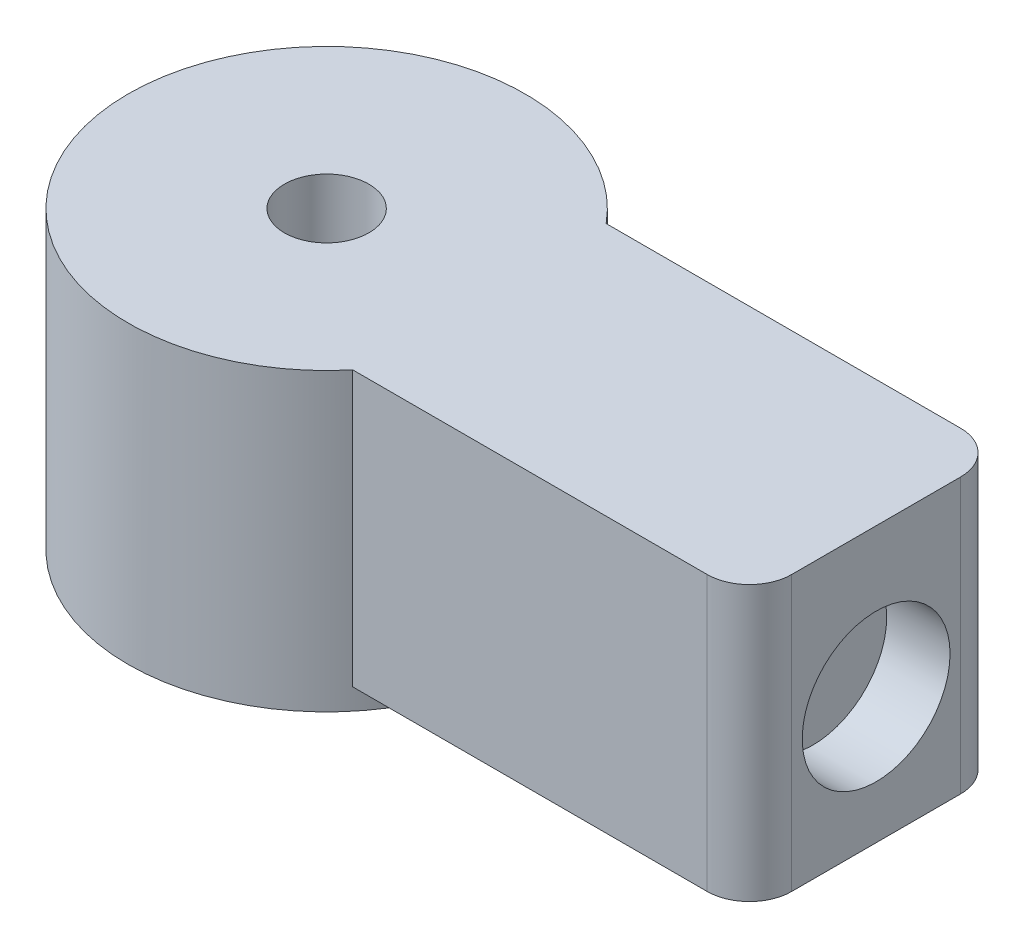
ISO-10303-21;
HEADER;
FILE_DESCRIPTION(('STEP AP214'),'2;1');
FILE_NAME('part.step','',(''),(''),'','','');
FILE_SCHEMA(('AUTOMOTIVE_DESIGN { 1 0 10303 214 1 1 1 1 }'));
ENDSEC;
DATA;
#1=APPLICATION_CONTEXT('core data for automotive mechanical design processes');
#2=APPLICATION_PROTOCOL_DEFINITION('international standard','automotive_design',2000,#1);
#3=PRODUCT_CONTEXT('',#1,'mechanical');
#4=PRODUCT('Part','Part','',(#3));
#5=PRODUCT_RELATED_PRODUCT_CATEGORY('part','',(#4));
#6=PRODUCT_DEFINITION_FORMATION('','',#4);
#7=PRODUCT_DEFINITION_CONTEXT('part definition',#1,'design');
#8=PRODUCT_DEFINITION('design','',#6,#7);
#9=PRODUCT_DEFINITION_SHAPE('','',#8);
#10=(LENGTH_UNIT() NAMED_UNIT(*) SI_UNIT(.MILLI.,.METRE.));
#11=(NAMED_UNIT(*) PLANE_ANGLE_UNIT() SI_UNIT($,.RADIAN.));
#12=(NAMED_UNIT(*) SI_UNIT($,.STERADIAN.) SOLID_ANGLE_UNIT());
#13=UNCERTAINTY_MEASURE_WITH_UNIT(LENGTH_MEASURE(1.E-05),#10,'distance_accuracy_value','');
#14=(GEOMETRIC_REPRESENTATION_CONTEXT(3) GLOBAL_UNCERTAINTY_ASSIGNED_CONTEXT((#13)) GLOBAL_UNIT_ASSIGNED_CONTEXT((#10,
#11,#12)) REPRESENTATION_CONTEXT('',''));
#15=CARTESIAN_POINT('',(0.,0.,0.));
#16=DIRECTION('',(0.,0.,1.));
#17=DIRECTION('',(1.,0.,0.));
#18=AXIS2_PLACEMENT_3D('',#15,#16,#17);
#19=CARTESIAN_POINT('',(0.,2.5,0.));
#20=DIRECTION('',(0.,-1.,0.));
#21=DIRECTION('',(0.,0.,-1.));
#22=AXIS2_PLACEMENT_3D('',#19,#20,#21);
#23=CYLINDRICAL_SURFACE('',#22,4.7);
#24=CARTESIAN_POINT('',(0.,0.,0.));
#25=DIRECTION('',(0.,1.,0.));
#26=DIRECTION('',(0.,0.,1.));
#27=AXIS2_PLACEMENT_3D('',#24,#25,#26);
#28=CIRCLE('',#27,4.7);
#29=CARTESIAN_POINT('',(0.,0.,4.7));
#30=VERTEX_POINT('',#29);
#31=EDGE_CURVE('E145',#30,#30,#28,.T.);
#32=ORIENTED_EDGE('',*,*,#31,.T.);
#33=EDGE_LOOP('',(#32));
#34=FACE_BOUND('',#33,.T.);
#35=CARTESIAN_POINT('',(0.,7.,0.));
#36=DIRECTION('',(0.,1.,0.));
#37=DIRECTION('',(0.,0.,1.));
#38=AXIS2_PLACEMENT_3D('',#35,#36,#37);
#39=CIRCLE('',#38,4.7);
#40=CARTESIAN_POINT('',(3.61801050302511,7.,-3.));
#41=VERTEX_POINT('',#40);
#42=CARTESIAN_POINT('',(3.61801050302511,7.,3.));
#43=VERTEX_POINT('',#42);
#44=EDGE_CURVE('E135',#41,#43,#39,.T.);
#45=ORIENTED_EDGE('',*,*,#44,.F.);
#46=DIRECTION('',(0.,-1.,0.));
#47=VECTOR('',#46,1.);
#48=CARTESIAN_POINT('',(3.61801050302511,2.5,-3.));
#49=LINE('',#48,#47);
#50=CARTESIAN_POINT('',(3.61801050302511,0.5,-3.));
#51=VERTEX_POINT('',#50);
#52=EDGE_CURVE('E50',#51,#41,#49,.F.);
#53=ORIENTED_EDGE('',*,*,#52,.F.);
#54=CARTESIAN_POINT('',(0.,0.5,0.));
#55=DIRECTION('',(0.,1.,0.));
#56=DIRECTION('',(0.,0.,1.));
#57=AXIS2_PLACEMENT_3D('',#54,#55,#56);
#58=CIRCLE('',#57,4.7);
#59=CARTESIAN_POINT('',(3.61801050302511,0.499999999999999,3.));
#60=VERTEX_POINT('',#59);
#61=EDGE_CURVE('E148',#60,#51,#58,.T.);
#62=ORIENTED_EDGE('',*,*,#61,.F.);
#63=DIRECTION('',(0.,-1.,0.));
#64=VECTOR('',#63,1.);
#65=CARTESIAN_POINT('',(3.61801050302511,2.5,3.));
#66=LINE('',#65,#64);
#67=EDGE_CURVE('E57',#43,#60,#66,.T.);
#68=ORIENTED_EDGE('',*,*,#67,.F.);
#69=EDGE_LOOP('',(#45,#53,#62,#68));
#70=FACE_BOUND('',#69,.T.);
#71=ADVANCED_FACE('F35',(#34,#70),#23,.T.);
#72=CARTESIAN_POINT('',(0.,0.,0.));
#73=DIRECTION('',(0.,1.,0.));
#74=DIRECTION('',(0.,0.,1.));
#75=AXIS2_PLACEMENT_3D('',#72,#73,#74);
#76=PLANE('',#75);
#77=ORIENTED_EDGE('',*,*,#31,.F.);
#78=EDGE_LOOP('',(#77));
#79=FACE_BOUND('',#78,.T.);
#80=CARTESIAN_POINT('',(0.,0.,0.));
#81=DIRECTION('',(0.,1.,0.));
#82=DIRECTION('',(0.,0.,1.));
#83=AXIS2_PLACEMENT_3D('',#80,#81,#82);
#84=CIRCLE('',#83,2.5);
#85=CARTESIAN_POINT('',(0.,0.,2.5));
#86=VERTEX_POINT('',#85);
#87=EDGE_CURVE('E142',#86,#86,#84,.T.);
#88=ORIENTED_EDGE('',*,*,#87,.T.);
#89=EDGE_LOOP('',(#88));
#90=FACE_BOUND('',#89,.T.);
#91=ADVANCED_FACE('F176',(#79,#90),#76,.F.);
#92=CARTESIAN_POINT('',(0.,2.5,0.));
#93=DIRECTION('',(0.,-1.,0.));
#94=DIRECTION('',(0.,0.,-1.));
#95=AXIS2_PLACEMENT_3D('',#92,#93,#94);
#96=CYLINDRICAL_SURFACE('',#95,2.5);
#97=CARTESIAN_POINT('',(0.,2.5,0.));
#98=DIRECTION('',(0.,1.,0.));
#99=DIRECTION('',(0.,0.,1.));
#100=AXIS2_PLACEMENT_3D('',#97,#98,#99);
#101=CIRCLE('',#100,2.5);
#102=CARTESIAN_POINT('',(0.,2.5,2.5));
#103=VERTEX_POINT('',#102);
#104=EDGE_CURVE('E139',#103,#103,#101,.T.);
#105=ORIENTED_EDGE('',*,*,#104,.T.);
#106=EDGE_LOOP('',(#105));
#107=FACE_BOUND('',#106,.T.);
#108=ORIENTED_EDGE('',*,*,#87,.F.);
#109=EDGE_LOOP('',(#108));
#110=FACE_BOUND('',#109,.T.);
#111=ADVANCED_FACE('F182',(#107,#110),#96,.F.);
#112=CARTESIAN_POINT('',(0.,2.5,0.));
#113=DIRECTION('',(0.,1.,0.));
#114=DIRECTION('',(0.,0.,1.));
#115=AXIS2_PLACEMENT_3D('',#112,#113,#114);
#116=PLANE('',#115);
#117=CARTESIAN_POINT('',(0.,2.5,0.));
#118=DIRECTION('',(0.,1.,0.));
#119=DIRECTION('',(0.,0.,1.));
#120=AXIS2_PLACEMENT_3D('',#117,#118,#119);
#121=CIRCLE('',#120,1.);
#122=CARTESIAN_POINT('',(0.,2.5,1.));
#123=VERTEX_POINT('',#122);
#124=EDGE_CURVE('E132',#123,#123,#121,.T.);
#125=ORIENTED_EDGE('',*,*,#124,.T.);
#126=EDGE_LOOP('',(#125));
#127=FACE_BOUND('',#126,.T.);
#128=ORIENTED_EDGE('',*,*,#104,.F.);
#129=EDGE_LOOP('',(#128));
#130=FACE_BOUND('',#129,.T.);
#131=ADVANCED_FACE('F251',(#127,#130),#116,.F.);
#132=CARTESIAN_POINT('',(0.,7.,0.));
#133=DIRECTION('',(0.,1.,0.));
#134=DIRECTION('',(0.,0.,1.));
#135=AXIS2_PLACEMENT_3D('',#132,#133,#134);
#136=PLANE('',#135);
#137=CARTESIAN_POINT('',(0.,7.,0.));
#138=DIRECTION('',(0.,1.,0.));
#139=DIRECTION('',(0.,0.,1.));
#140=AXIS2_PLACEMENT_3D('',#137,#138,#139);
#141=CIRCLE('',#140,1.);
#142=CARTESIAN_POINT('',(0.,7.,1.));
#143=VERTEX_POINT('',#142);
#144=EDGE_CURVE('E131',#143,#143,#141,.T.);
#145=ORIENTED_EDGE('',*,*,#144,.F.);
#146=EDGE_LOOP('',(#145));
#147=FACE_BOUND('',#146,.T.);
#148=ORIENTED_EDGE('',*,*,#44,.T.);
#149=DIRECTION('',(1.,0.,0.));
#150=VECTOR('',#149,1.);
#151=CARTESIAN_POINT('',(3.61801050302511,7.,3.));
#152=LINE('',#151,#150);
#153=CARTESIAN_POINT('',(12.01,7.,3.));
#154=VERTEX_POINT('',#153);
#155=EDGE_CURVE('E111',#43,#154,#152,.T.);
#156=ORIENTED_EDGE('',*,*,#155,.T.);
#157=CARTESIAN_POINT('',(12.01,7.,2.));
#158=DIRECTION('',(0.,1.,0.));
#159=DIRECTION('',(0.,0.,1.));
#160=AXIS2_PLACEMENT_3D('',#157,#158,#159);
#161=CIRCLE('',#160,1.);
#162=CARTESIAN_POINT('',(13.01,7.,2.));
#163=VERTEX_POINT('',#162);
#164=EDGE_CURVE('E92',#154,#163,#161,.T.);
#165=ORIENTED_EDGE('',*,*,#164,.T.);
#166=DIRECTION('',(0.,0.,-1.));
#167=VECTOR('',#166,1.);
#168=CARTESIAN_POINT('',(13.01,7.,2.));
#169=LINE('',#168,#167);
#170=CARTESIAN_POINT('',(13.01,7.,-2.));
#171=VERTEX_POINT('',#170);
#172=EDGE_CURVE('E101',#163,#171,#169,.T.);
#173=ORIENTED_EDGE('',*,*,#172,.T.);
#174=CARTESIAN_POINT('',(12.01,7.,-2.));
#175=DIRECTION('',(0.,1.,0.));
#176=DIRECTION('',(0.,0.,1.));
#177=AXIS2_PLACEMENT_3D('',#174,#175,#176);
#178=CIRCLE('',#177,1.);
#179=CARTESIAN_POINT('',(12.01,7.,-3.));
#180=VERTEX_POINT('',#179);
#181=EDGE_CURVE('E107',#171,#180,#178,.T.);
#182=ORIENTED_EDGE('',*,*,#181,.T.);
#183=DIRECTION('',(-1.,0.,0.));
#184=VECTOR('',#183,1.);
#185=CARTESIAN_POINT('',(12.01,7.,-3.));
#186=LINE('',#185,#184);
#187=EDGE_CURVE('E123',#180,#41,#186,.T.);
#188=ORIENTED_EDGE('',*,*,#187,.T.);
#189=EDGE_LOOP('',(#148,#156,#165,#173,#182,#188));
#190=FACE_BOUND('',#189,.T.);
#191=ADVANCED_FACE('F109',(#147,#190),#136,.T.);
#192=CARTESIAN_POINT('',(0.,2.5,0.));
#193=DIRECTION('',(0.,1.,0.));
#194=DIRECTION('',(0.,0.,1.));
#195=AXIS2_PLACEMENT_3D('',#192,#193,#194);
#196=CYLINDRICAL_SURFACE('',#195,1.);
#197=ORIENTED_EDGE('',*,*,#124,.F.);
#198=EDGE_LOOP('',(#197));
#199=FACE_BOUND('',#198,.T.);
#200=ORIENTED_EDGE('',*,*,#144,.T.);
#201=EDGE_LOOP('',(#200));
#202=FACE_BOUND('',#201,.T.);
#203=ADVANCED_FACE('F165',(#199,#202),#196,.F.);
#204=CARTESIAN_POINT('',(2.7,6.5,-3.));
#205=DIRECTION('',(0.,0.,1.));
#206=DIRECTION('',(0.,-1.,0.));
#207=AXIS2_PLACEMENT_3D('',#204,#205,#206);
#208=PLANE('',#207);
#209=ORIENTED_EDGE('',*,*,#52,.T.);
#210=ORIENTED_EDGE('',*,*,#187,.F.);
#211=DIRECTION('',(0.,1.,0.));
#212=VECTOR('',#211,1.);
#213=CARTESIAN_POINT('',(12.01,6.5,-3.));
#214=LINE('',#213,#212);
#215=CARTESIAN_POINT('',(12.01,0.5,-3.));
#216=VERTEX_POINT('',#215);
#217=EDGE_CURVE('E154',#180,#216,#214,.F.);
#218=ORIENTED_EDGE('',*,*,#217,.T.);
#219=DIRECTION('',(1.,0.,0.));
#220=VECTOR('',#219,1.);
#221=CARTESIAN_POINT('',(2.7,0.5,-3.));
#222=LINE('',#221,#220);
#223=EDGE_CURVE('E128',#51,#216,#222,.T.);
#224=ORIENTED_EDGE('',*,*,#223,.F.);
#225=EDGE_LOOP('',(#209,#210,#218,#224));
#226=FACE_BOUND('',#225,.T.);
#227=ADVANCED_FACE('F163',(#226),#208,.F.);
#228=CARTESIAN_POINT('',(2.7,0.5,-3.));
#229=DIRECTION('',(0.,1.,0.));
#230=DIRECTION('',(0.,0.,1.));
#231=AXIS2_PLACEMENT_3D('',#228,#229,#230);
#232=PLANE('',#231);
#233=ORIENTED_EDGE('',*,*,#223,.T.);
#234=CARTESIAN_POINT('',(12.01,0.5,-2.));
#235=DIRECTION('',(0.,1.,0.));
#236=DIRECTION('',(0.,0.,1.));
#237=AXIS2_PLACEMENT_3D('',#234,#235,#236);
#238=CIRCLE('',#237,1.);
#239=CARTESIAN_POINT('',(13.01,0.5,-2.));
#240=VERTEX_POINT('',#239);
#241=EDGE_CURVE('E43',#216,#240,#238,.F.);
#242=ORIENTED_EDGE('',*,*,#241,.T.);
#243=DIRECTION('',(0.,0.,-1.));
#244=VECTOR('',#243,1.);
#245=CARTESIAN_POINT('',(13.01,0.5,-3.));
#246=LINE('',#245,#244);
#247=CARTESIAN_POINT('',(13.01,0.499999999999999,2.));
#248=VERTEX_POINT('',#247);
#249=EDGE_CURVE('E119',#248,#240,#246,.T.);
#250=ORIENTED_EDGE('',*,*,#249,.F.);
#251=CARTESIAN_POINT('',(12.01,0.499999999999999,2.));
#252=DIRECTION('',(0.,1.,0.));
#253=DIRECTION('',(0.,0.,1.));
#254=AXIS2_PLACEMENT_3D('',#251,#252,#253);
#255=CIRCLE('',#254,1.);
#256=CARTESIAN_POINT('',(12.01,0.499999999999999,3.));
#257=VERTEX_POINT('',#256);
#258=EDGE_CURVE('E94',#248,#257,#255,.F.);
#259=ORIENTED_EDGE('',*,*,#258,.T.);
#260=DIRECTION('',(1.,0.,0.));
#261=VECTOR('',#260,1.);
#262=CARTESIAN_POINT('',(2.7,0.499999999999999,3.));
#263=LINE('',#262,#261);
#264=EDGE_CURVE('E125',#60,#257,#263,.T.);
#265=ORIENTED_EDGE('',*,*,#264,.F.);
#266=ORIENTED_EDGE('',*,*,#61,.T.);
#267=EDGE_LOOP('',(#233,#242,#250,#259,#265,#266));
#268=FACE_BOUND('',#267,.T.);
#269=ADVANCED_FACE('F158',(#268),#232,.F.);
#270=CARTESIAN_POINT('',(2.7,0.499999999999999,3.));
#271=DIRECTION('',(0.,0.,-1.));
#272=DIRECTION('',(0.,1.,0.));
#273=AXIS2_PLACEMENT_3D('',#270,#271,#272);
#274=PLANE('',#273);
#275=ORIENTED_EDGE('',*,*,#264,.T.);
#276=DIRECTION('',(0.,-1.,0.));
#277=VECTOR('',#276,1.);
#278=CARTESIAN_POINT('',(12.01,0.499999999999999,3.));
#279=LINE('',#278,#277);
#280=EDGE_CURVE('E11',#257,#154,#279,.F.);
#281=ORIENTED_EDGE('',*,*,#280,.T.);
#282=ORIENTED_EDGE('',*,*,#155,.F.);
#283=ORIENTED_EDGE('',*,*,#67,.T.);
#284=EDGE_LOOP('',(#275,#281,#282,#283));
#285=FACE_BOUND('',#284,.T.);
#286=ADVANCED_FACE('F171',(#285),#274,.F.);
#287=CARTESIAN_POINT('',(13.01,0.,0.));
#288=DIRECTION('',(-1.,0.,0.));
#289=DIRECTION('',(0.,0.,1.));
#290=AXIS2_PLACEMENT_3D('',#287,#288,#289);
#291=PLANE('',#290);
#292=CARTESIAN_POINT('',(13.01,3.5,0.));
#293=DIRECTION('',(1.,0.,0.));
#294=DIRECTION('',(0.,0.,-1.));
#295=AXIS2_PLACEMENT_3D('',#292,#293,#294);
#296=CIRCLE('',#295,1.75);
#297=CARTESIAN_POINT('',(13.01,3.5,-1.75));
#298=VERTEX_POINT('',#297);
#299=EDGE_CURVE('E120',#298,#298,#296,.T.);
#300=ORIENTED_EDGE('',*,*,#299,.F.);
#301=EDGE_LOOP('',(#300));
#302=FACE_BOUND('',#301,.T.);
#303=ORIENTED_EDGE('',*,*,#249,.T.);
#304=DIRECTION('',(0.,1.,0.));
#305=VECTOR('',#304,1.);
#306=CARTESIAN_POINT('',(13.01,0.,-2.));
#307=LINE('',#306,#305);
#308=EDGE_CURVE('E98',#240,#171,#307,.T.);
#309=ORIENTED_EDGE('',*,*,#308,.T.);
#310=ORIENTED_EDGE('',*,*,#172,.F.);
#311=DIRECTION('',(0.,-1.,0.));
#312=VECTOR('',#311,1.);
#313=CARTESIAN_POINT('',(13.01,0.,2.));
#314=LINE('',#313,#312);
#315=EDGE_CURVE('E88',#163,#248,#314,.T.);
#316=ORIENTED_EDGE('',*,*,#315,.T.);
#317=EDGE_LOOP('',(#303,#309,#310,#316));
#318=FACE_BOUND('',#317,.T.);
#319=ADVANCED_FACE('F102',(#302,#318),#291,.F.);
#320=CARTESIAN_POINT('',(12.01,0.,-2.));
#321=DIRECTION('',(0.,1.,0.));
#322=DIRECTION('',(0.,0.,1.));
#323=AXIS2_PLACEMENT_3D('',#320,#321,#322);
#324=CYLINDRICAL_SURFACE('',#323,1.);
#325=ORIENTED_EDGE('',*,*,#241,.F.);
#326=ORIENTED_EDGE('',*,*,#217,.F.);
#327=ORIENTED_EDGE('',*,*,#181,.F.);
#328=ORIENTED_EDGE('',*,*,#308,.F.);
#329=EDGE_LOOP('',(#325,#326,#327,#328));
#330=FACE_BOUND('',#329,.T.);
#331=ADVANCED_FACE('F160',(#330),#324,.T.);
#332=CARTESIAN_POINT('',(12.01,0.,2.));
#333=DIRECTION('',(0.,-1.,0.));
#334=DIRECTION('',(0.,0.,-1.));
#335=AXIS2_PLACEMENT_3D('',#332,#333,#334);
#336=CYLINDRICAL_SURFACE('',#335,1.);
#337=ORIENTED_EDGE('',*,*,#315,.F.);
#338=ORIENTED_EDGE('',*,*,#164,.F.);
#339=ORIENTED_EDGE('',*,*,#280,.F.);
#340=ORIENTED_EDGE('',*,*,#258,.F.);
#341=EDGE_LOOP('',(#337,#338,#339,#340));
#342=FACE_BOUND('',#341,.T.);
#343=ADVANCED_FACE('F37',(#342),#336,.T.);
#344=CARTESIAN_POINT('',(11.51,3.5,0.));
#345=DIRECTION('',(1.,0.,0.));
#346=DIRECTION('',(0.,0.,-1.));
#347=AXIS2_PLACEMENT_3D('',#344,#345,#346);
#348=CYLINDRICAL_SURFACE('',#347,1.75);
#349=CARTESIAN_POINT('',(11.51,3.5,0.));
#350=DIRECTION('',(1.,0.,0.));
#351=DIRECTION('',(0.,0.,-1.));
#352=AXIS2_PLACEMENT_3D('',#349,#350,#351);
#353=CIRCLE('',#352,1.75);
#354=CARTESIAN_POINT('',(11.51,3.5,-1.75));
#355=VERTEX_POINT('',#354);
#356=EDGE_CURVE('E116',#355,#355,#353,.T.);
#357=ORIENTED_EDGE('',*,*,#356,.F.);
#358=EDGE_LOOP('',(#357));
#359=FACE_BOUND('',#358,.T.);
#360=ORIENTED_EDGE('',*,*,#299,.T.);
#361=EDGE_LOOP('',(#360));
#362=FACE_BOUND('',#361,.T.);
#363=ADVANCED_FACE('F191',(#359,#362),#348,.F.);
#364=CARTESIAN_POINT('',(11.51,3.5,0.));
#365=DIRECTION('',(1.,0.,0.));
#366=DIRECTION('',(0.,0.,-1.));
#367=AXIS2_PLACEMENT_3D('',#364,#365,#366);
#368=PLANE('',#367);
#369=ORIENTED_EDGE('',*,*,#356,.T.);
#370=EDGE_LOOP('',(#369));
#371=FACE_BOUND('',#370,.T.);
#372=ADVANCED_FACE('F203',(#371),#368,.T.);
#373=CLOSED_SHELL('',(#71,#91,#111,#131,#191,#203,#227,#269,#286,#319,#331,#343,#363,#372));
#374=MANIFOLD_SOLID_BREP('B2',#373);
#375=ADVANCED_BREP_SHAPE_REPRESENTATION('',(#18,#374),#14);
#376=SHAPE_DEFINITION_REPRESENTATION(#9,#375);
ENDSEC;
END-ISO-10303-21;
